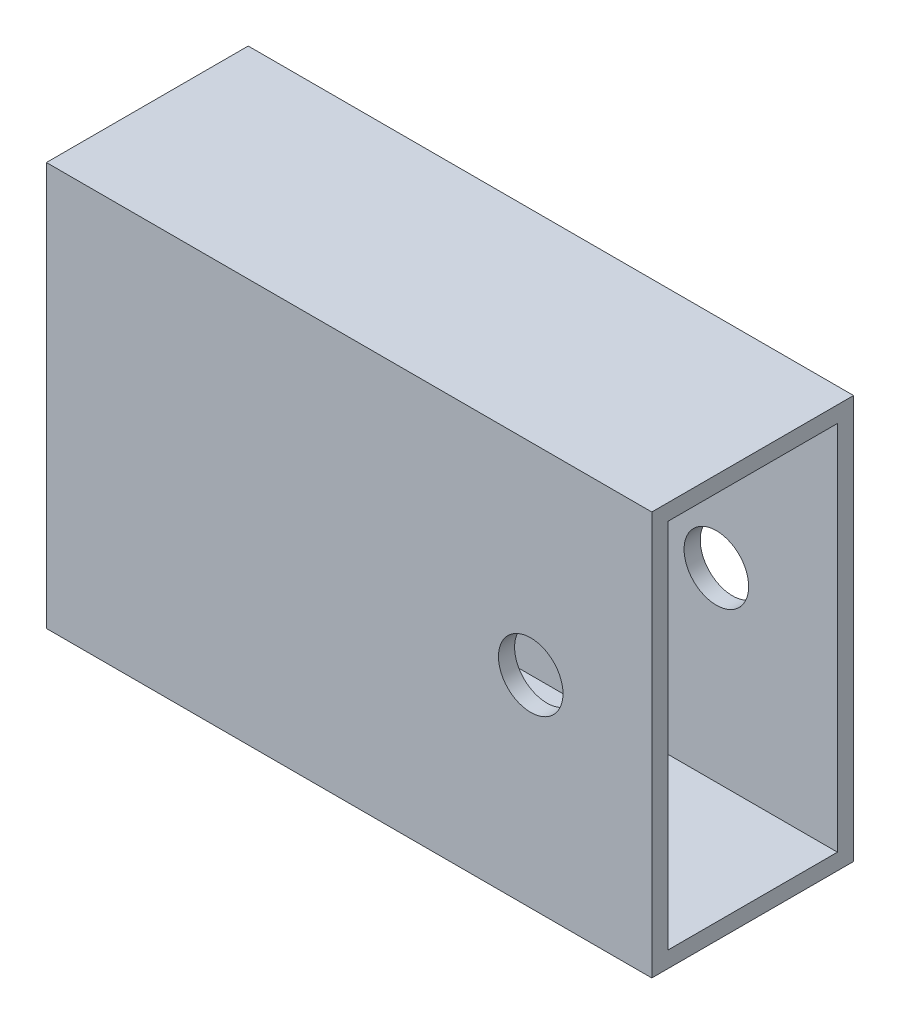
ISO-10303-21;
HEADER;
FILE_DESCRIPTION(('STEP AP214'),'2;1');
FILE_NAME('part.step','',(''),(''),'','','');
FILE_SCHEMA(('AUTOMOTIVE_DESIGN { 1 0 10303 214 1 1 1 1 }'));
ENDSEC;
DATA;
#1=APPLICATION_CONTEXT('core data for automotive mechanical design processes');
#2=APPLICATION_PROTOCOL_DEFINITION('international standard','automotive_design',2000,#1);
#3=PRODUCT_CONTEXT('',#1,'mechanical');
#4=PRODUCT('Part','Part','',(#3));
#5=PRODUCT_RELATED_PRODUCT_CATEGORY('part','',(#4));
#6=PRODUCT_DEFINITION_FORMATION('','',#4);
#7=PRODUCT_DEFINITION_CONTEXT('part definition',#1,'design');
#8=PRODUCT_DEFINITION('design','',#6,#7);
#9=PRODUCT_DEFINITION_SHAPE('','',#8);
#10=(LENGTH_UNIT() NAMED_UNIT(*) SI_UNIT(.MILLI.,.METRE.));
#11=(NAMED_UNIT(*) PLANE_ANGLE_UNIT() SI_UNIT($,.RADIAN.));
#12=(NAMED_UNIT(*) SI_UNIT($,.STERADIAN.) SOLID_ANGLE_UNIT());
#13=UNCERTAINTY_MEASURE_WITH_UNIT(LENGTH_MEASURE(1.E-05),#10,'distance_accuracy_value','');
#14=(GEOMETRIC_REPRESENTATION_CONTEXT(3) GLOBAL_UNCERTAINTY_ASSIGNED_CONTEXT((#13)) GLOBAL_UNIT_ASSIGNED_CONTEXT((#10,
#11,#12)) REPRESENTATION_CONTEXT('',''));
#15=CARTESIAN_POINT('',(0.,0.,0.));
#16=DIRECTION('',(0.,0.,1.));
#17=DIRECTION('',(1.,0.,0.));
#18=AXIS2_PLACEMENT_3D('',#15,#16,#17);
#19=CARTESIAN_POINT('',(75.,0.,0.));
#20=DIRECTION('',(-1.,0.,0.));
#21=DIRECTION('',(0.,0.,1.));
#22=AXIS2_PLACEMENT_3D('',#19,#20,#21);
#23=PLANE('',#22);
#24=DIRECTION('',(0.,-1.,0.));
#25=VECTOR('',#24,1.);
#26=CARTESIAN_POINT('',(75.,0.,0.));
#27=LINE('',#26,#25);
#28=CARTESIAN_POINT('',(75.,50.,0.));
#29=VERTEX_POINT('',#28);
#30=CARTESIAN_POINT('',(75.,0.,0.));
#31=VERTEX_POINT('',#30);
#32=EDGE_CURVE('E136',#29,#31,#27,.T.);
#33=ORIENTED_EDGE('',*,*,#32,.T.);
#34=DIRECTION('',(0.,0.,-1.));
#35=VECTOR('',#34,1.);
#36=CARTESIAN_POINT('',(75.,0.,0.));
#37=LINE('',#36,#35);
#38=CARTESIAN_POINT('',(75.,0.,-25.));
#39=VERTEX_POINT('',#38);
#40=EDGE_CURVE('E139',#31,#39,#37,.T.);
#41=ORIENTED_EDGE('',*,*,#40,.T.);
#42=DIRECTION('',(0.,1.,0.));
#43=VECTOR('',#42,1.);
#44=CARTESIAN_POINT('',(75.,0.,-25.));
#45=LINE('',#44,#43);
#46=CARTESIAN_POINT('',(75.,50.,-25.));
#47=VERTEX_POINT('',#46);
#48=EDGE_CURVE('E142',#39,#47,#45,.T.);
#49=ORIENTED_EDGE('',*,*,#48,.T.);
#50=DIRECTION('',(0.,0.,1.));
#51=VECTOR('',#50,1.);
#52=CARTESIAN_POINT('',(75.,50.,0.));
#53=LINE('',#52,#51);
#54=EDGE_CURVE('E144',#47,#29,#53,.T.);
#55=ORIENTED_EDGE('',*,*,#54,.T.);
#56=EDGE_LOOP('',(#33,#41,#49,#55));
#57=FACE_BOUND('',#56,.T.);
#58=DIRECTION('',(0.,-1.,0.));
#59=VECTOR('',#58,1.);
#60=CARTESIAN_POINT('',(75.,2.,-2.));
#61=LINE('',#60,#59);
#62=CARTESIAN_POINT('',(75.,48.,-2.));
#63=VERTEX_POINT('',#62);
#64=CARTESIAN_POINT('',(75.,2.,-2.));
#65=VERTEX_POINT('',#64);
#66=EDGE_CURVE('E98',#63,#65,#61,.T.);
#67=ORIENTED_EDGE('',*,*,#66,.F.);
#68=DIRECTION('',(0.,0.,1.));
#69=VECTOR('',#68,1.);
#70=CARTESIAN_POINT('',(75.,48.,-2.));
#71=LINE('',#70,#69);
#72=CARTESIAN_POINT('',(75.,48.,-23.));
#73=VERTEX_POINT('',#72);
#74=EDGE_CURVE('E120',#73,#63,#71,.T.);
#75=ORIENTED_EDGE('',*,*,#74,.F.);
#76=DIRECTION('',(0.,1.,0.));
#77=VECTOR('',#76,1.);
#78=CARTESIAN_POINT('',(75.,2.,-23.));
#79=LINE('',#78,#77);
#80=CARTESIAN_POINT('',(75.,2.,-23.));
#81=VERTEX_POINT('',#80);
#82=EDGE_CURVE('E118',#81,#73,#79,.T.);
#83=ORIENTED_EDGE('',*,*,#82,.F.);
#84=DIRECTION('',(0.,0.,-1.));
#85=VECTOR('',#84,1.);
#86=CARTESIAN_POINT('',(75.,2.,-2.));
#87=LINE('',#86,#85);
#88=EDGE_CURVE('E106',#65,#81,#87,.T.);
#89=ORIENTED_EDGE('',*,*,#88,.F.);
#90=EDGE_LOOP('',(#67,#75,#83,#89));
#91=FACE_BOUND('',#90,.T.);
#92=ADVANCED_FACE('F32',(#57,#91),#23,.F.);
#93=CARTESIAN_POINT('',(0.,0.,0.));
#94=DIRECTION('',(-1.,0.,0.));
#95=DIRECTION('',(0.,0.,1.));
#96=AXIS2_PLACEMENT_3D('',#93,#94,#95);
#97=PLANE('',#96);
#98=DIRECTION('',(0.,-1.,0.));
#99=VECTOR('',#98,1.);
#100=CARTESIAN_POINT('',(0.,0.,0.));
#101=LINE('',#100,#99);
#102=CARTESIAN_POINT('',(0.,50.,0.));
#103=VERTEX_POINT('',#102);
#104=CARTESIAN_POINT('',(0.,0.,0.));
#105=VERTEX_POINT('',#104);
#106=EDGE_CURVE('E114',#103,#105,#101,.T.);
#107=ORIENTED_EDGE('',*,*,#106,.F.);
#108=DIRECTION('',(0.,0.,1.));
#109=VECTOR('',#108,1.);
#110=CARTESIAN_POINT('',(0.,50.,0.));
#111=LINE('',#110,#109);
#112=CARTESIAN_POINT('',(0.,50.,-25.));
#113=VERTEX_POINT('',#112);
#114=EDGE_CURVE('E140',#113,#103,#111,.T.);
#115=ORIENTED_EDGE('',*,*,#114,.F.);
#116=DIRECTION('',(0.,1.,0.));
#117=VECTOR('',#116,1.);
#118=CARTESIAN_POINT('',(0.,0.,-25.));
#119=LINE('',#118,#117);
#120=CARTESIAN_POINT('',(0.,0.,-25.));
#121=VERTEX_POINT('',#120);
#122=EDGE_CURVE('E151',#121,#113,#119,.T.);
#123=ORIENTED_EDGE('',*,*,#122,.F.);
#124=DIRECTION('',(0.,0.,-1.));
#125=VECTOR('',#124,1.);
#126=CARTESIAN_POINT('',(0.,0.,0.));
#127=LINE('',#126,#125);
#128=EDGE_CURVE('E149',#105,#121,#127,.T.);
#129=ORIENTED_EDGE('',*,*,#128,.F.);
#130=EDGE_LOOP('',(#107,#115,#123,#129));
#131=FACE_BOUND('',#130,.T.);
#132=DIRECTION('',(0.,0.,1.));
#133=VECTOR('',#132,1.);
#134=CARTESIAN_POINT('',(0.,48.,-2.));
#135=LINE('',#134,#133);
#136=CARTESIAN_POINT('',(0.,48.,-23.));
#137=VERTEX_POINT('',#136);
#138=CARTESIAN_POINT('',(0.,48.,-2.));
#139=VERTEX_POINT('',#138);
#140=EDGE_CURVE('E107',#137,#139,#135,.T.);
#141=ORIENTED_EDGE('',*,*,#140,.T.);
#142=DIRECTION('',(0.,-1.,0.));
#143=VECTOR('',#142,1.);
#144=CARTESIAN_POINT('',(0.,2.,-2.));
#145=LINE('',#144,#143);
#146=CARTESIAN_POINT('',(0.,2.,-2.));
#147=VERTEX_POINT('',#146);
#148=EDGE_CURVE('E56',#139,#147,#145,.T.);
#149=ORIENTED_EDGE('',*,*,#148,.T.);
#150=DIRECTION('',(0.,0.,-1.));
#151=VECTOR('',#150,1.);
#152=CARTESIAN_POINT('',(0.,2.,-2.));
#153=LINE('',#152,#151);
#154=CARTESIAN_POINT('',(0.,2.,-23.));
#155=VERTEX_POINT('',#154);
#156=EDGE_CURVE('E113',#147,#155,#153,.T.);
#157=ORIENTED_EDGE('',*,*,#156,.T.);
#158=DIRECTION('',(0.,1.,0.));
#159=VECTOR('',#158,1.);
#160=CARTESIAN_POINT('',(0.,2.,-23.));
#161=LINE('',#160,#159);
#162=EDGE_CURVE('E128',#155,#137,#161,.T.);
#163=ORIENTED_EDGE('',*,*,#162,.T.);
#164=EDGE_LOOP('',(#141,#149,#157,#163));
#165=FACE_BOUND('',#164,.T.);
#166=ADVANCED_FACE('F170',(#131,#165),#97,.T.);
#167=CARTESIAN_POINT('',(75.,0.,0.));
#168=DIRECTION('',(0.,0.,-1.));
#169=DIRECTION('',(0.,1.,0.));
#170=AXIS2_PLACEMENT_3D('',#167,#168,#169);
#171=PLANE('',#170);
#172=CARTESIAN_POINT('',(60.,25.,0.));
#173=DIRECTION('',(0.,0.,1.));
#174=DIRECTION('',(1.,0.,0.));
#175=AXIS2_PLACEMENT_3D('',#172,#173,#174);
#176=CIRCLE('',#175,3.99999999999999);
#177=CARTESIAN_POINT('',(64.,25.,0.));
#178=VERTEX_POINT('',#177);
#179=EDGE_CURVE('E213',#178,#178,#176,.T.);
#180=ORIENTED_EDGE('',*,*,#179,.F.);
#181=EDGE_LOOP('',(#180));
#182=FACE_BOUND('',#181,.T.);
#183=ORIENTED_EDGE('',*,*,#106,.T.);
#184=DIRECTION('',(-1.,0.,0.));
#185=VECTOR('',#184,1.);
#186=CARTESIAN_POINT('',(75.,0.,0.));
#187=LINE('',#186,#185);
#188=EDGE_CURVE('E11',#31,#105,#187,.T.);
#189=ORIENTED_EDGE('',*,*,#188,.F.);
#190=ORIENTED_EDGE('',*,*,#32,.F.);
#191=DIRECTION('',(-1.,0.,0.));
#192=VECTOR('',#191,1.);
#193=CARTESIAN_POINT('',(75.,50.,0.));
#194=LINE('',#193,#192);
#195=EDGE_CURVE('E146',#29,#103,#194,.T.);
#196=ORIENTED_EDGE('',*,*,#195,.T.);
#197=EDGE_LOOP('',(#183,#189,#190,#196));
#198=FACE_BOUND('',#197,.T.);
#199=ADVANCED_FACE('F34',(#182,#198),#171,.F.);
#200=CARTESIAN_POINT('',(75.,0.,0.));
#201=DIRECTION('',(0.,1.,0.));
#202=DIRECTION('',(0.,0.,1.));
#203=AXIS2_PLACEMENT_3D('',#200,#201,#202);
#204=PLANE('',#203);
#205=ORIENTED_EDGE('',*,*,#128,.T.);
#206=DIRECTION('',(-1.,0.,0.));
#207=VECTOR('',#206,1.);
#208=CARTESIAN_POINT('',(75.,0.,-25.));
#209=LINE('',#208,#207);
#210=EDGE_CURVE('E41',#39,#121,#209,.T.);
#211=ORIENTED_EDGE('',*,*,#210,.F.);
#212=ORIENTED_EDGE('',*,*,#40,.F.);
#213=ORIENTED_EDGE('',*,*,#188,.T.);
#214=EDGE_LOOP('',(#205,#211,#212,#213));
#215=FACE_BOUND('',#214,.T.);
#216=ADVANCED_FACE('F180',(#215),#204,.F.);
#217=CARTESIAN_POINT('',(75.,0.,-25.));
#218=DIRECTION('',(0.,0.,1.));
#219=DIRECTION('',(0.,-1.,0.));
#220=AXIS2_PLACEMENT_3D('',#217,#218,#219);
#221=PLANE('',#220);
#222=CARTESIAN_POINT('',(60.,25.,-25.));
#223=DIRECTION('',(0.,0.,1.));
#224=DIRECTION('',(1.,0.,0.));
#225=AXIS2_PLACEMENT_3D('',#222,#223,#224);
#226=CIRCLE('',#225,3.99999999999999);
#227=CARTESIAN_POINT('',(64.,25.,-25.));
#228=VERTEX_POINT('',#227);
#229=EDGE_CURVE('E211',#228,#228,#226,.T.);
#230=ORIENTED_EDGE('',*,*,#229,.T.);
#231=EDGE_LOOP('',(#230));
#232=FACE_BOUND('',#231,.T.);
#233=ORIENTED_EDGE('',*,*,#122,.T.);
#234=DIRECTION('',(-1.,0.,0.));
#235=VECTOR('',#234,1.);
#236=CARTESIAN_POINT('',(75.,50.,-25.));
#237=LINE('',#236,#235);
#238=EDGE_CURVE('E156',#47,#113,#237,.T.);
#239=ORIENTED_EDGE('',*,*,#238,.F.);
#240=ORIENTED_EDGE('',*,*,#48,.F.);
#241=ORIENTED_EDGE('',*,*,#210,.T.);
#242=EDGE_LOOP('',(#233,#239,#240,#241));
#243=FACE_BOUND('',#242,.T.);
#244=ADVANCED_FACE('F164',(#232,#243),#221,.F.);
#245=CARTESIAN_POINT('',(75.,50.,0.));
#246=DIRECTION('',(0.,-1.,0.));
#247=DIRECTION('',(0.,0.,-1.));
#248=AXIS2_PLACEMENT_3D('',#245,#246,#247);
#249=PLANE('',#248);
#250=ORIENTED_EDGE('',*,*,#114,.T.);
#251=ORIENTED_EDGE('',*,*,#195,.F.);
#252=ORIENTED_EDGE('',*,*,#54,.F.);
#253=ORIENTED_EDGE('',*,*,#238,.T.);
#254=EDGE_LOOP('',(#250,#251,#252,#253));
#255=FACE_BOUND('',#254,.T.);
#256=ADVANCED_FACE('F174',(#255),#249,.F.);
#257=CARTESIAN_POINT('',(75.,2.,-2.));
#258=DIRECTION('',(0.,0.,-1.));
#259=DIRECTION('',(-1.,0.,0.));
#260=AXIS2_PLACEMENT_3D('',#257,#258,#259);
#261=PLANE('',#260);
#262=CARTESIAN_POINT('',(60.,25.,-2.));
#263=DIRECTION('',(0.,0.,-1.));
#264=DIRECTION('',(-1.,0.,0.));
#265=AXIS2_PLACEMENT_3D('',#262,#263,#264);
#266=CIRCLE('',#265,3.99999999999999);
#267=CARTESIAN_POINT('',(56.,25.,-2.));
#268=VERTEX_POINT('',#267);
#269=EDGE_CURVE('E126',#268,#268,#266,.T.);
#270=ORIENTED_EDGE('',*,*,#269,.F.);
#271=EDGE_LOOP('',(#270));
#272=FACE_BOUND('',#271,.T.);
#273=ORIENTED_EDGE('',*,*,#148,.F.);
#274=DIRECTION('',(-1.,0.,0.));
#275=VECTOR('',#274,1.);
#276=CARTESIAN_POINT('',(75.,48.,-2.));
#277=LINE('',#276,#275);
#278=EDGE_CURVE('E102',#63,#139,#277,.T.);
#279=ORIENTED_EDGE('',*,*,#278,.F.);
#280=ORIENTED_EDGE('',*,*,#66,.T.);
#281=DIRECTION('',(-1.,0.,0.));
#282=VECTOR('',#281,1.);
#283=CARTESIAN_POINT('',(75.,2.,-2.));
#284=LINE('',#283,#282);
#285=EDGE_CURVE('E101',#65,#147,#284,.T.);
#286=ORIENTED_EDGE('',*,*,#285,.T.);
#287=EDGE_LOOP('',(#273,#279,#280,#286));
#288=FACE_BOUND('',#287,.T.);
#289=ADVANCED_FACE('F100',(#272,#288),#261,.T.);
#290=CARTESIAN_POINT('',(75.,2.,-2.));
#291=DIRECTION('',(0.,1.,0.));
#292=DIRECTION('',(0.,0.,1.));
#293=AXIS2_PLACEMENT_3D('',#290,#291,#292);
#294=PLANE('',#293);
#295=ORIENTED_EDGE('',*,*,#156,.F.);
#296=ORIENTED_EDGE('',*,*,#285,.F.);
#297=ORIENTED_EDGE('',*,*,#88,.T.);
#298=DIRECTION('',(-1.,0.,0.));
#299=VECTOR('',#298,1.);
#300=CARTESIAN_POINT('',(75.,2.,-23.));
#301=LINE('',#300,#299);
#302=EDGE_CURVE('E115',#81,#155,#301,.T.);
#303=ORIENTED_EDGE('',*,*,#302,.T.);
#304=EDGE_LOOP('',(#295,#296,#297,#303));
#305=FACE_BOUND('',#304,.T.);
#306=ADVANCED_FACE('F110',(#305),#294,.T.);
#307=CARTESIAN_POINT('',(75.,2.,-23.));
#308=DIRECTION('',(0.,0.,1.));
#309=DIRECTION('',(1.,0.,0.));
#310=AXIS2_PLACEMENT_3D('',#307,#308,#309);
#311=PLANE('',#310);
#312=CARTESIAN_POINT('',(60.,25.,-23.));
#313=DIRECTION('',(0.,0.,1.));
#314=DIRECTION('',(1.,0.,0.));
#315=AXIS2_PLACEMENT_3D('',#312,#313,#314);
#316=CIRCLE('',#315,3.99999999999999);
#317=CARTESIAN_POINT('',(64.,25.,-23.));
#318=VERTEX_POINT('',#317);
#319=EDGE_CURVE('E36',#318,#318,#316,.T.);
#320=ORIENTED_EDGE('',*,*,#319,.F.);
#321=EDGE_LOOP('',(#320));
#322=FACE_BOUND('',#321,.T.);
#323=ORIENTED_EDGE('',*,*,#162,.F.);
#324=ORIENTED_EDGE('',*,*,#302,.F.);
#325=ORIENTED_EDGE('',*,*,#82,.T.);
#326=DIRECTION('',(-1.,0.,0.));
#327=VECTOR('',#326,1.);
#328=CARTESIAN_POINT('',(75.,48.,-23.));
#329=LINE('',#328,#327);
#330=EDGE_CURVE('E48',#73,#137,#329,.T.);
#331=ORIENTED_EDGE('',*,*,#330,.T.);
#332=EDGE_LOOP('',(#323,#324,#325,#331));
#333=FACE_BOUND('',#332,.T.);
#334=ADVANCED_FACE('F206',(#322,#333),#311,.T.);
#335=CARTESIAN_POINT('',(75.,48.,-2.));
#336=DIRECTION('',(0.,-1.,0.));
#337=DIRECTION('',(0.,0.,-1.));
#338=AXIS2_PLACEMENT_3D('',#335,#336,#337);
#339=PLANE('',#338);
#340=ORIENTED_EDGE('',*,*,#140,.F.);
#341=ORIENTED_EDGE('',*,*,#330,.F.);
#342=ORIENTED_EDGE('',*,*,#74,.T.);
#343=ORIENTED_EDGE('',*,*,#278,.T.);
#344=EDGE_LOOP('',(#340,#341,#342,#343));
#345=FACE_BOUND('',#344,.T.);
#346=ADVANCED_FACE('F222',(#345),#339,.T.);
#347=CARTESIAN_POINT('',(60.,25.,-25.));
#348=DIRECTION('',(0.,0.,1.));
#349=DIRECTION('',(1.,0.,0.));
#350=AXIS2_PLACEMENT_3D('',#347,#348,#349);
#351=CYLINDRICAL_SURFACE('',#350,3.99999999999999);
#352=ORIENTED_EDGE('',*,*,#319,.T.);
#353=EDGE_LOOP('',(#352));
#354=FACE_BOUND('',#353,.T.);
#355=ORIENTED_EDGE('',*,*,#229,.F.);
#356=EDGE_LOOP('',(#355));
#357=FACE_BOUND('',#356,.T.);
#358=ADVANCED_FACE('F219',(#354,#357),#351,.F.);
#359=ORIENTED_EDGE('',*,*,#269,.T.);
#360=EDGE_LOOP('',(#359));
#361=FACE_BOUND('',#360,.T.);
#362=ORIENTED_EDGE('',*,*,#179,.T.);
#363=EDGE_LOOP('',(#362));
#364=FACE_BOUND('',#363,.T.);
#365=ADVANCED_FACE('F221',(#361,#364),#351,.F.);
#366=CLOSED_SHELL('',(#92,#166,#199,#216,#244,#256,#289,#306,#334,#346,#358,#365));
#367=MANIFOLD_SOLID_BREP('B2',#366);
#368=ADVANCED_BREP_SHAPE_REPRESENTATION('',(#18,#367),#14);
#369=SHAPE_DEFINITION_REPRESENTATION(#9,#368);
ENDSEC;
END-ISO-10303-21;
